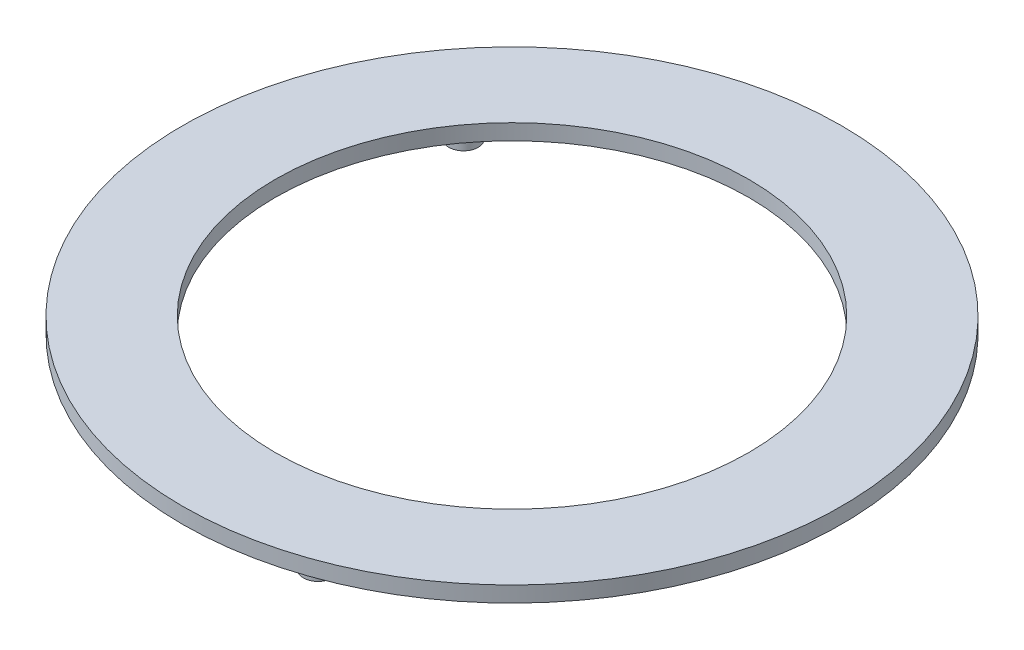
ISO-10303-21;
HEADER;
FILE_DESCRIPTION(('STEP AP214'),'2;1');
FILE_NAME('part.step','',(''),(''),'','','');
FILE_SCHEMA(('AUTOMOTIVE_DESIGN { 1 0 10303 214 1 1 1 1 }'));
ENDSEC;
DATA;
#1=APPLICATION_CONTEXT('core data for automotive mechanical design processes');
#2=APPLICATION_PROTOCOL_DEFINITION('international standard','automotive_design',2000,#1);
#3=PRODUCT_CONTEXT('',#1,'mechanical');
#4=PRODUCT('Part','Part','',(#3));
#5=PRODUCT_RELATED_PRODUCT_CATEGORY('part','',(#4));
#6=PRODUCT_DEFINITION_FORMATION('','',#4);
#7=PRODUCT_DEFINITION_CONTEXT('part definition',#1,'design');
#8=PRODUCT_DEFINITION('design','',#6,#7);
#9=PRODUCT_DEFINITION_SHAPE('','',#8);
#10=(LENGTH_UNIT() NAMED_UNIT(*) SI_UNIT(.MILLI.,.METRE.));
#11=(NAMED_UNIT(*) PLANE_ANGLE_UNIT() SI_UNIT($,.RADIAN.));
#12=(NAMED_UNIT(*) SI_UNIT($,.STERADIAN.) SOLID_ANGLE_UNIT());
#13=UNCERTAINTY_MEASURE_WITH_UNIT(LENGTH_MEASURE(1.E-05),#10,'distance_accuracy_value','');
#14=(GEOMETRIC_REPRESENTATION_CONTEXT(3) GLOBAL_UNCERTAINTY_ASSIGNED_CONTEXT((#13)) GLOBAL_UNIT_ASSIGNED_CONTEXT((#10,
#11,#12)) REPRESENTATION_CONTEXT('',''));
#15=CARTESIAN_POINT('',(0.,0.,0.));
#16=DIRECTION('',(0.,0.,1.));
#17=DIRECTION('',(1.,0.,0.));
#18=AXIS2_PLACEMENT_3D('',#15,#16,#17);
#19=CARTESIAN_POINT('',(0.,1.5,0.));
#20=DIRECTION('',(0.,-1.,0.));
#21=DIRECTION('',(0.,0.,-1.));
#22=AXIS2_PLACEMENT_3D('',#19,#20,#21);
#23=CYLINDRICAL_SURFACE('',#22,22.625);
#24=CARTESIAN_POINT('',(0.,1.5,0.));
#25=DIRECTION('',(0.,1.,0.));
#26=DIRECTION('',(0.,0.,1.));
#27=AXIS2_PLACEMENT_3D('',#24,#25,#26);
#28=CIRCLE('',#27,22.625);
#29=CARTESIAN_POINT('',(0.,1.5,22.625));
#30=VERTEX_POINT('',#29);
#31=EDGE_CURVE('E47',#30,#30,#28,.T.);
#32=ORIENTED_EDGE('',*,*,#31,.T.);
#33=EDGE_LOOP('',(#32));
#34=FACE_BOUND('',#33,.T.);
#35=CARTESIAN_POINT('',(0.,0.,0.));
#36=DIRECTION('',(0.,1.,0.));
#37=DIRECTION('',(0.,0.,1.));
#38=AXIS2_PLACEMENT_3D('',#35,#36,#37);
#39=CIRCLE('',#38,22.625);
#40=CARTESIAN_POINT('',(0.,0.,22.625));
#41=VERTEX_POINT('',#40);
#42=EDGE_CURVE('E55',#41,#41,#39,.T.);
#43=ORIENTED_EDGE('',*,*,#42,.F.);
#44=EDGE_LOOP('',(#43));
#45=FACE_BOUND('',#44,.T.);
#46=ADVANCED_FACE('F39',(#34,#45),#23,.F.);
#47=CARTESIAN_POINT('',(0.,1.5,0.));
#48=DIRECTION('',(0.,-1.,0.));
#49=DIRECTION('',(0.,0.,-1.));
#50=AXIS2_PLACEMENT_3D('',#47,#48,#49);
#51=CYLINDRICAL_SURFACE('',#50,31.5);
#52=CARTESIAN_POINT('',(0.,1.5,0.));
#53=DIRECTION('',(0.,1.,0.));
#54=DIRECTION('',(0.,0.,1.));
#55=AXIS2_PLACEMENT_3D('',#52,#53,#54);
#56=CIRCLE('',#55,31.5);
#57=CARTESIAN_POINT('',(0.,1.5,31.5));
#58=VERTEX_POINT('',#57);
#59=EDGE_CURVE('E10',#58,#58,#56,.T.);
#60=ORIENTED_EDGE('',*,*,#59,.F.);
#61=EDGE_LOOP('',(#60));
#62=FACE_BOUND('',#61,.T.);
#63=CARTESIAN_POINT('',(0.,0.,0.));
#64=DIRECTION('',(0.,1.,0.));
#65=DIRECTION('',(0.,0.,1.));
#66=AXIS2_PLACEMENT_3D('',#63,#64,#65);
#67=CIRCLE('',#66,31.5);
#68=CARTESIAN_POINT('',(0.,0.,31.5));
#69=VERTEX_POINT('',#68);
#70=EDGE_CURVE('E42',#69,#69,#67,.T.);
#71=ORIENTED_EDGE('',*,*,#70,.T.);
#72=EDGE_LOOP('',(#71));
#73=FACE_BOUND('',#72,.T.);
#74=ADVANCED_FACE('F117',(#62,#73),#51,.T.);
#75=CARTESIAN_POINT('',(0.,1.5,0.));
#76=DIRECTION('',(0.,1.,0.));
#77=DIRECTION('',(0.,0.,1.));
#78=AXIS2_PLACEMENT_3D('',#75,#76,#77);
#79=PLANE('',#78);
#80=ORIENTED_EDGE('',*,*,#31,.F.);
#81=EDGE_LOOP('',(#80));
#82=FACE_BOUND('',#81,.T.);
#83=ORIENTED_EDGE('',*,*,#59,.T.);
#84=EDGE_LOOP('',(#83));
#85=FACE_BOUND('',#84,.T.);
#86=ADVANCED_FACE('F122',(#82,#85),#79,.T.);
#87=CARTESIAN_POINT('',(0.,0.,0.));
#88=DIRECTION('',(0.,1.,0.));
#89=DIRECTION('',(0.,0.,1.));
#90=AXIS2_PLACEMENT_3D('',#87,#88,#89);
#91=PLANE('',#90);
#92=CARTESIAN_POINT('',(-22.3946019343418,0.,15.0824999321172));
#93=DIRECTION('',(0.,1.,0.));
#94=DIRECTION('',(0.,0.,1.));
#95=AXIS2_PLACEMENT_3D('',#92,#93,#94);
#96=CIRCLE('',#95,1.4);
#97=CARTESIAN_POINT('',(-22.3946019343418,0.,16.4824999321172));
#98=VERTEX_POINT('',#97);
#99=EDGE_CURVE('E97',#98,#98,#96,.T.);
#100=ORIENTED_EDGE('',*,*,#99,.T.);
#101=EDGE_LOOP('',(#100));
#102=FACE_BOUND('',#101,.T.);
#103=CARTESIAN_POINT('',(7.42399726248892,0.,25.9592808961751));
#104=DIRECTION('',(0.,1.,0.));
#105=DIRECTION('',(0.,0.,1.));
#106=AXIS2_PLACEMENT_3D('',#103,#104,#105);
#107=CIRCLE('',#106,1.4);
#108=CARTESIAN_POINT('',(7.42399726248892,0.,27.3592808961751));
#109=VERTEX_POINT('',#108);
#110=EDGE_CURVE('E89',#109,#109,#107,.T.);
#111=ORIENTED_EDGE('',*,*,#110,.T.);
#112=EDGE_LOOP('',(#111));
#113=FACE_BOUND('',#112,.T.);
#114=CARTESIAN_POINT('',(26.9828845749471,0.,0.961217985223595));
#115=DIRECTION('',(0.,1.,0.));
#116=DIRECTION('',(0.,0.,1.));
#117=AXIS2_PLACEMENT_3D('',#114,#115,#116);
#118=CIRCLE('',#117,1.4);
#119=CARTESIAN_POINT('',(26.9828845749471,0.,2.36121798522359));
#120=VERTEX_POINT('',#119);
#121=EDGE_CURVE('E81',#120,#120,#118,.T.);
#122=ORIENTED_EDGE('',*,*,#121,.T.);
#123=EDGE_LOOP('',(#122));
#124=FACE_BOUND('',#123,.T.);
#125=CARTESIAN_POINT('',(9.25234251934464,0.,-25.3652155107105));
#126=DIRECTION('',(0.,1.,0.));
#127=DIRECTION('',(0.,0.,1.));
#128=AXIS2_PLACEMENT_3D('',#125,#126,#127);
#129=CIRCLE('',#128,1.4);
#130=CARTESIAN_POINT('',(9.25234251934464,0.,-23.9652155107105));
#131=VERTEX_POINT('',#130);
#132=EDGE_CURVE('E73',#131,#131,#129,.T.);
#133=ORIENTED_EDGE('',*,*,#132,.T.);
#134=EDGE_LOOP('',(#133));
#135=FACE_BOUND('',#134,.T.);
#136=CARTESIAN_POINT('',(-21.2646224224353,0.,-16.6377833028099));
#137=DIRECTION('',(0.,1.,0.));
#138=DIRECTION('',(0.,0.,1.));
#139=AXIS2_PLACEMENT_3D('',#136,#137,#138);
#140=CIRCLE('',#139,1.4);
#141=CARTESIAN_POINT('',(-21.2646224224353,0.,-15.2377833028099));
#142=VERTEX_POINT('',#141);
#143=EDGE_CURVE('E65',#142,#142,#140,.T.);
#144=ORIENTED_EDGE('',*,*,#143,.T.);
#145=EDGE_LOOP('',(#144));
#146=FACE_BOUND('',#145,.T.);
#147=ORIENTED_EDGE('',*,*,#42,.T.);
#148=EDGE_LOOP('',(#147));
#149=FACE_BOUND('',#148,.T.);
#150=ORIENTED_EDGE('',*,*,#70,.F.);
#151=EDGE_LOOP('',(#150));
#152=FACE_BOUND('',#151,.T.);
#153=ADVANCED_FACE('F128',(#102,#113,#124,#135,#146,#149,#152),#91,.F.);
#154=CARTESIAN_POINT('',(-21.2646224224353,-2.8,-16.6377833028099));
#155=DIRECTION('',(0.,1.,0.));
#156=DIRECTION('',(0.,0.,1.));
#157=AXIS2_PLACEMENT_3D('',#154,#155,#156);
#158=CYLINDRICAL_SURFACE('',#157,1.4);
#159=CARTESIAN_POINT('',(-21.2646224224353,-2.8,-16.6377833028099));
#160=DIRECTION('',(0.,1.,0.));
#161=DIRECTION('',(0.,0.,1.));
#162=AXIS2_PLACEMENT_3D('',#159,#160,#161);
#163=CIRCLE('',#162,1.4);
#164=CARTESIAN_POINT('',(-21.2646224224353,-2.8,-15.2377833028099));
#165=VERTEX_POINT('',#164);
#166=EDGE_CURVE('E58',#165,#165,#163,.T.);
#167=ORIENTED_EDGE('',*,*,#166,.T.);
#168=EDGE_LOOP('',(#167));
#169=FACE_BOUND('',#168,.T.);
#170=ORIENTED_EDGE('',*,*,#143,.F.);
#171=EDGE_LOOP('',(#170));
#172=FACE_BOUND('',#171,.T.);
#173=ADVANCED_FACE('F133',(#169,#172),#158,.T.);
#174=CARTESIAN_POINT('',(-21.2646224224353,-2.8,-16.6377833028099));
#175=DIRECTION('',(0.,1.,0.));
#176=DIRECTION('',(0.,0.,1.));
#177=AXIS2_PLACEMENT_3D('',#174,#175,#176);
#178=PLANE('',#177);
#179=ORIENTED_EDGE('',*,*,#166,.F.);
#180=EDGE_LOOP('',(#179));
#181=FACE_BOUND('',#180,.T.);
#182=ADVANCED_FACE('F139',(#181),#178,.F.);
#183=CARTESIAN_POINT('',(9.25234251934464,-2.8,-25.3652155107105));
#184=DIRECTION('',(0.,1.,0.));
#185=DIRECTION('',(0.,0.,1.));
#186=AXIS2_PLACEMENT_3D('',#183,#184,#185);
#187=CYLINDRICAL_SURFACE('',#186,1.4);
#188=CARTESIAN_POINT('',(9.25234251934464,-2.8,-25.3652155107105));
#189=DIRECTION('',(0.,1.,0.));
#190=DIRECTION('',(0.,0.,1.));
#191=AXIS2_PLACEMENT_3D('',#188,#189,#190);
#192=CIRCLE('',#191,1.4);
#193=CARTESIAN_POINT('',(9.25234251934464,-2.8,-23.9652155107105));
#194=VERTEX_POINT('',#193);
#195=EDGE_CURVE('E71',#194,#194,#192,.T.);
#196=ORIENTED_EDGE('',*,*,#195,.T.);
#197=EDGE_LOOP('',(#196));
#198=FACE_BOUND('',#197,.T.);
#199=ORIENTED_EDGE('',*,*,#132,.F.);
#200=EDGE_LOOP('',(#199));
#201=FACE_BOUND('',#200,.T.);
#202=ADVANCED_FACE('F142',(#198,#201),#187,.T.);
#203=CARTESIAN_POINT('',(9.25234251934464,-2.8,-25.3652155107105));
#204=DIRECTION('',(0.,1.,0.));
#205=DIRECTION('',(0.,0.,1.));
#206=AXIS2_PLACEMENT_3D('',#203,#204,#205);
#207=PLANE('',#206);
#208=ORIENTED_EDGE('',*,*,#195,.F.);
#209=EDGE_LOOP('',(#208));
#210=FACE_BOUND('',#209,.T.);
#211=ADVANCED_FACE('F146',(#210),#207,.F.);
#212=CARTESIAN_POINT('',(26.9828845749471,-2.8,0.961217985223595));
#213=DIRECTION('',(0.,1.,0.));
#214=DIRECTION('',(0.,0.,1.));
#215=AXIS2_PLACEMENT_3D('',#212,#213,#214);
#216=CYLINDRICAL_SURFACE('',#215,1.4);
#217=CARTESIAN_POINT('',(26.9828845749471,-2.8,0.961217985223595));
#218=DIRECTION('',(0.,1.,0.));
#219=DIRECTION('',(0.,0.,1.));
#220=AXIS2_PLACEMENT_3D('',#217,#218,#219);
#221=CIRCLE('',#220,1.4);
#222=CARTESIAN_POINT('',(26.9828845749471,-2.8,2.36121798522359));
#223=VERTEX_POINT('',#222);
#224=EDGE_CURVE('E77',#223,#223,#221,.T.);
#225=ORIENTED_EDGE('',*,*,#224,.T.);
#226=EDGE_LOOP('',(#225));
#227=FACE_BOUND('',#226,.T.);
#228=ORIENTED_EDGE('',*,*,#121,.F.);
#229=EDGE_LOOP('',(#228));
#230=FACE_BOUND('',#229,.T.);
#231=ADVANCED_FACE('F150',(#227,#230),#216,.T.);
#232=CARTESIAN_POINT('',(26.9828845749471,-2.8,0.961217985223595));
#233=DIRECTION('',(0.,1.,0.));
#234=DIRECTION('',(0.,0.,1.));
#235=AXIS2_PLACEMENT_3D('',#232,#233,#234);
#236=PLANE('',#235);
#237=ORIENTED_EDGE('',*,*,#224,.F.);
#238=EDGE_LOOP('',(#237));
#239=FACE_BOUND('',#238,.T.);
#240=ADVANCED_FACE('F154',(#239),#236,.F.);
#241=CARTESIAN_POINT('',(7.42399726248892,-2.8,25.9592808961751));
#242=DIRECTION('',(0.,1.,0.));
#243=DIRECTION('',(0.,0.,1.));
#244=AXIS2_PLACEMENT_3D('',#241,#242,#243);
#245=CYLINDRICAL_SURFACE('',#244,1.4);
#246=CARTESIAN_POINT('',(7.42399726248892,-2.8,25.9592808961751));
#247=DIRECTION('',(0.,1.,0.));
#248=DIRECTION('',(0.,0.,1.));
#249=AXIS2_PLACEMENT_3D('',#246,#247,#248);
#250=CIRCLE('',#249,1.4);
#251=CARTESIAN_POINT('',(7.42399726248892,-2.8,27.3592808961751));
#252=VERTEX_POINT('',#251);
#253=EDGE_CURVE('E85',#252,#252,#250,.T.);
#254=ORIENTED_EDGE('',*,*,#253,.T.);
#255=EDGE_LOOP('',(#254));
#256=FACE_BOUND('',#255,.T.);
#257=ORIENTED_EDGE('',*,*,#110,.F.);
#258=EDGE_LOOP('',(#257));
#259=FACE_BOUND('',#258,.T.);
#260=ADVANCED_FACE('F158',(#256,#259),#245,.T.);
#261=CARTESIAN_POINT('',(7.42399726248892,-2.8,25.9592808961751));
#262=DIRECTION('',(0.,1.,0.));
#263=DIRECTION('',(0.,0.,1.));
#264=AXIS2_PLACEMENT_3D('',#261,#262,#263);
#265=PLANE('',#264);
#266=ORIENTED_EDGE('',*,*,#253,.F.);
#267=EDGE_LOOP('',(#266));
#268=FACE_BOUND('',#267,.T.);
#269=ADVANCED_FACE('F114',(#268),#265,.F.);
#270=CARTESIAN_POINT('',(-22.3946019343418,-2.8,15.0824999321172));
#271=DIRECTION('',(0.,1.,0.));
#272=DIRECTION('',(0.,0.,1.));
#273=AXIS2_PLACEMENT_3D('',#270,#271,#272);
#274=CYLINDRICAL_SURFACE('',#273,1.4);
#275=CARTESIAN_POINT('',(-22.3946019343418,-2.8,15.0824999321172));
#276=DIRECTION('',(0.,1.,0.));
#277=DIRECTION('',(0.,0.,1.));
#278=AXIS2_PLACEMENT_3D('',#275,#276,#277);
#279=CIRCLE('',#278,1.4);
#280=CARTESIAN_POINT('',(-22.3946019343418,-2.8,16.4824999321172));
#281=VERTEX_POINT('',#280);
#282=EDGE_CURVE('E93',#281,#281,#279,.T.);
#283=ORIENTED_EDGE('',*,*,#282,.T.);
#284=EDGE_LOOP('',(#283));
#285=FACE_BOUND('',#284,.T.);
#286=ORIENTED_EDGE('',*,*,#99,.F.);
#287=EDGE_LOOP('',(#286));
#288=FACE_BOUND('',#287,.T.);
#289=ADVANCED_FACE('F105',(#285,#288),#274,.T.);
#290=CARTESIAN_POINT('',(-22.3946019343418,-2.8,15.0824999321172));
#291=DIRECTION('',(0.,1.,0.));
#292=DIRECTION('',(0.,0.,1.));
#293=AXIS2_PLACEMENT_3D('',#290,#291,#292);
#294=PLANE('',#293);
#295=ORIENTED_EDGE('',*,*,#282,.F.);
#296=EDGE_LOOP('',(#295));
#297=FACE_BOUND('',#296,.T.);
#298=ADVANCED_FACE('F108',(#297),#294,.F.);
#299=CLOSED_SHELL('',(#46,#74,#86,#153,#173,#182,#202,#211,#231,#240,#260,#269,#289,#298));
#300=MANIFOLD_SOLID_BREP('B2',#299);
#301=ADVANCED_BREP_SHAPE_REPRESENTATION('',(#18,#300),#14);
#302=SHAPE_DEFINITION_REPRESENTATION(#9,#301);
ENDSEC;
END-ISO-10303-21;
